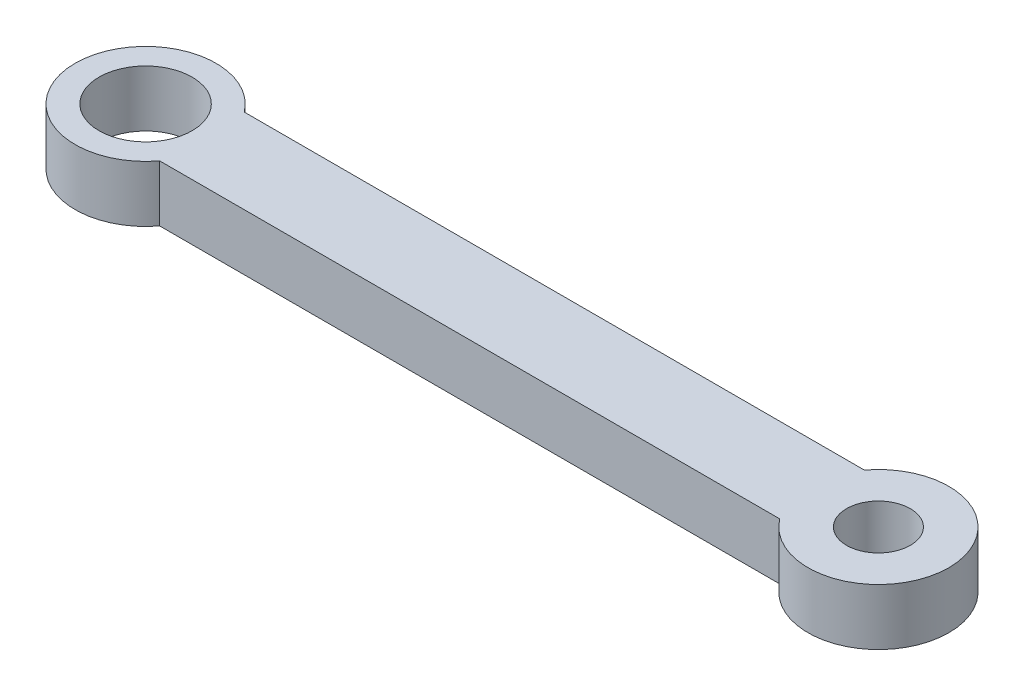
ISO-10303-21;
HEADER;
FILE_DESCRIPTION(('STEP AP214'),'2;1');
FILE_NAME('part.step','',(''),(''),'','','');
FILE_SCHEMA(('AUTOMOTIVE_DESIGN { 1 0 10303 214 1 1 1 1 }'));
ENDSEC;
DATA;
#1=APPLICATION_CONTEXT('core data for automotive mechanical design processes');
#2=APPLICATION_PROTOCOL_DEFINITION('international standard','automotive_design',2000,#1);
#3=PRODUCT_CONTEXT('',#1,'mechanical');
#4=PRODUCT('Part','Part','',(#3));
#5=PRODUCT_RELATED_PRODUCT_CATEGORY('part','',(#4));
#6=PRODUCT_DEFINITION_FORMATION('','',#4);
#7=PRODUCT_DEFINITION_CONTEXT('part definition',#1,'design');
#8=PRODUCT_DEFINITION('design','',#6,#7);
#9=PRODUCT_DEFINITION_SHAPE('','',#8);
#10=(LENGTH_UNIT() NAMED_UNIT(*) SI_UNIT(.MILLI.,.METRE.));
#11=(NAMED_UNIT(*) PLANE_ANGLE_UNIT() SI_UNIT($,.RADIAN.));
#12=(NAMED_UNIT(*) SI_UNIT($,.STERADIAN.) SOLID_ANGLE_UNIT());
#13=UNCERTAINTY_MEASURE_WITH_UNIT(LENGTH_MEASURE(1.E-05),#10,'distance_accuracy_value','');
#14=(GEOMETRIC_REPRESENTATION_CONTEXT(3) GLOBAL_UNCERTAINTY_ASSIGNED_CONTEXT((#13)) GLOBAL_UNIT_ASSIGNED_CONTEXT((#10,
#11,#12)) REPRESENTATION_CONTEXT('',''));
#15=CARTESIAN_POINT('',(0.,0.,0.));
#16=DIRECTION('',(0.,0.,1.));
#17=DIRECTION('',(1.,0.,0.));
#18=AXIS2_PLACEMENT_3D('',#15,#16,#17);
#19=CARTESIAN_POINT('',(-13.,2.,0.));
#20=DIRECTION('',(0.,1.,0.));
#21=DIRECTION('',(0.,0.,1.));
#22=AXIS2_PLACEMENT_3D('',#19,#20,#21);
#23=PLANE('',#22);
#24=CARTESIAN_POINT('',(-13.,2.,0.));
#25=DIRECTION('',(0.,1.,0.));
#26=DIRECTION('',(0.,0.,1.));
#27=AXIS2_PLACEMENT_3D('',#24,#25,#26);
#28=CIRCLE('',#27,1.65);
#29=CARTESIAN_POINT('',(-13.,2.,1.65));
#30=VERTEX_POINT('',#29);
#31=EDGE_CURVE('E100',#30,#30,#28,.T.);
#32=ORIENTED_EDGE('',*,*,#31,.F.);
#33=EDGE_LOOP('',(#32));
#34=FACE_BOUND('',#33,.T.);
#35=CARTESIAN_POINT('',(-13.,2.,0.));
#36=DIRECTION('',(0.,1.,0.));
#37=DIRECTION('',(0.,0.,1.));
#38=AXIS2_PLACEMENT_3D('',#35,#36,#37);
#39=CIRCLE('',#38,2.5);
#40=CARTESIAN_POINT('',(-11.,2.,-1.5));
#41=VERTEX_POINT('',#40);
#42=CARTESIAN_POINT('',(-11.,2.,1.5));
#43=VERTEX_POINT('',#42);
#44=EDGE_CURVE('E85',#41,#43,#39,.T.);
#45=ORIENTED_EDGE('',*,*,#44,.T.);
#46=DIRECTION('',(1.,0.,0.));
#47=VECTOR('',#46,1.);
#48=CARTESIAN_POINT('',(-11.,2.,1.5));
#49=LINE('',#48,#47);
#50=CARTESIAN_POINT('',(11.,2.,1.5));
#51=VERTEX_POINT('',#50);
#52=EDGE_CURVE('E80',#43,#51,#49,.T.);
#53=ORIENTED_EDGE('',*,*,#52,.T.);
#54=CARTESIAN_POINT('',(13.,2.,0.));
#55=DIRECTION('',(0.,1.,0.));
#56=DIRECTION('',(0.,0.,-1.));
#57=AXIS2_PLACEMENT_3D('',#54,#55,#56);
#58=CIRCLE('',#57,2.5);
#59=CARTESIAN_POINT('',(11.,2.,-1.50000000000001));
#60=VERTEX_POINT('',#59);
#61=EDGE_CURVE('E83',#51,#60,#58,.T.);
#62=ORIENTED_EDGE('',*,*,#61,.T.);
#63=DIRECTION('',(-1.,0.,0.));
#64=VECTOR('',#63,1.);
#65=CARTESIAN_POINT('',(-11.,2.,-1.5));
#66=LINE('',#65,#64);
#67=EDGE_CURVE('E50',#60,#41,#66,.T.);
#68=ORIENTED_EDGE('',*,*,#67,.T.);
#69=EDGE_LOOP('',(#45,#53,#62,#68));
#70=FACE_BOUND('',#69,.T.);
#71=CARTESIAN_POINT('',(13.,2.,0.));
#72=DIRECTION('',(0.,1.,0.));
#73=DIRECTION('',(0.,0.,1.));
#74=AXIS2_PLACEMENT_3D('',#71,#72,#73);
#75=CIRCLE('',#74,1.1303);
#76=CARTESIAN_POINT('',(13.,2.,1.1303));
#77=VERTEX_POINT('',#76);
#78=EDGE_CURVE('E115',#77,#77,#75,.T.);
#79=ORIENTED_EDGE('',*,*,#78,.F.);
#80=EDGE_LOOP('',(#79));
#81=FACE_BOUND('',#80,.T.);
#82=ADVANCED_FACE('F33',(#34,#70,#81),#23,.T.);
#83=CARTESIAN_POINT('',(-13.,0.,0.));
#84=DIRECTION('',(0.,1.,0.));
#85=DIRECTION('',(0.,0.,1.));
#86=AXIS2_PLACEMENT_3D('',#83,#84,#85);
#87=PLANE('',#86);
#88=CARTESIAN_POINT('',(-13.,0.,0.));
#89=DIRECTION('',(0.,1.,0.));
#90=DIRECTION('',(0.,0.,1.));
#91=AXIS2_PLACEMENT_3D('',#88,#89,#90);
#92=CIRCLE('',#91,2.5);
#93=CARTESIAN_POINT('',(-11.,0.,-1.5));
#94=VERTEX_POINT('',#93);
#95=CARTESIAN_POINT('',(-11.,0.,1.5));
#96=VERTEX_POINT('',#95);
#97=EDGE_CURVE('E97',#94,#96,#92,.T.);
#98=ORIENTED_EDGE('',*,*,#97,.F.);
#99=DIRECTION('',(-1.,0.,0.));
#100=VECTOR('',#99,1.);
#101=CARTESIAN_POINT('',(-11.,0.,-1.5));
#102=LINE('',#101,#100);
#103=CARTESIAN_POINT('',(11.,0.,-1.50000000000001));
#104=VERTEX_POINT('',#103);
#105=EDGE_CURVE('E73',#104,#94,#102,.T.);
#106=ORIENTED_EDGE('',*,*,#105,.F.);
#107=CARTESIAN_POINT('',(13.,0.,0.));
#108=DIRECTION('',(0.,1.,0.));
#109=DIRECTION('',(0.,0.,-1.));
#110=AXIS2_PLACEMENT_3D('',#107,#108,#109);
#111=CIRCLE('',#110,2.5);
#112=CARTESIAN_POINT('',(11.,0.,1.5));
#113=VERTEX_POINT('',#112);
#114=EDGE_CURVE('E67',#113,#104,#111,.T.);
#115=ORIENTED_EDGE('',*,*,#114,.F.);
#116=DIRECTION('',(1.,0.,0.));
#117=VECTOR('',#116,1.);
#118=CARTESIAN_POINT('',(-11.,0.,1.5));
#119=LINE('',#118,#117);
#120=EDGE_CURVE('E89',#96,#113,#119,.T.);
#121=ORIENTED_EDGE('',*,*,#120,.F.);
#122=EDGE_LOOP('',(#98,#106,#115,#121));
#123=FACE_BOUND('',#122,.T.);
#124=CARTESIAN_POINT('',(-13.,0.,0.));
#125=DIRECTION('',(0.,1.,0.));
#126=DIRECTION('',(0.,0.,1.));
#127=AXIS2_PLACEMENT_3D('',#124,#125,#126);
#128=CIRCLE('',#127,1.65);
#129=CARTESIAN_POINT('',(-13.,0.,1.65));
#130=VERTEX_POINT('',#129);
#131=EDGE_CURVE('E112',#130,#130,#128,.T.);
#132=ORIENTED_EDGE('',*,*,#131,.T.);
#133=EDGE_LOOP('',(#132));
#134=FACE_BOUND('',#133,.T.);
#135=CARTESIAN_POINT('',(13.,0.,0.));
#136=DIRECTION('',(0.,1.,0.));
#137=DIRECTION('',(0.,0.,1.));
#138=AXIS2_PLACEMENT_3D('',#135,#136,#137);
#139=CIRCLE('',#138,1.1303);
#140=CARTESIAN_POINT('',(13.,0.,1.1303));
#141=VERTEX_POINT('',#140);
#142=EDGE_CURVE('E118',#141,#141,#139,.T.);
#143=ORIENTED_EDGE('',*,*,#142,.T.);
#144=EDGE_LOOP('',(#143));
#145=FACE_BOUND('',#144,.T.);
#146=ADVANCED_FACE('F108',(#123,#134,#145),#87,.F.);
#147=CARTESIAN_POINT('',(-13.,2.,0.));
#148=DIRECTION('',(0.,-1.,0.));
#149=DIRECTION('',(0.,0.,-1.));
#150=AXIS2_PLACEMENT_3D('',#147,#148,#149);
#151=CYLINDRICAL_SURFACE('',#150,2.5);
#152=ORIENTED_EDGE('',*,*,#97,.T.);
#153=DIRECTION('',(0.,-1.,0.));
#154=VECTOR('',#153,1.);
#155=CARTESIAN_POINT('',(-11.,2.,1.5));
#156=LINE('',#155,#154);
#157=EDGE_CURVE('E11',#43,#96,#156,.T.);
#158=ORIENTED_EDGE('',*,*,#157,.F.);
#159=ORIENTED_EDGE('',*,*,#44,.F.);
#160=DIRECTION('',(0.,-1.,0.));
#161=VECTOR('',#160,1.);
#162=CARTESIAN_POINT('',(-11.,2.,-1.5));
#163=LINE('',#162,#161);
#164=EDGE_CURVE('E93',#41,#94,#163,.T.);
#165=ORIENTED_EDGE('',*,*,#164,.T.);
#166=EDGE_LOOP('',(#152,#158,#159,#165));
#167=FACE_BOUND('',#166,.T.);
#168=ADVANCED_FACE('F35',(#167),#151,.T.);
#169=CARTESIAN_POINT('',(-11.,2.,1.5));
#170=DIRECTION('',(0.,0.,-1.));
#171=DIRECTION('',(-1.,0.,0.));
#172=AXIS2_PLACEMENT_3D('',#169,#170,#171);
#173=PLANE('',#172);
#174=ORIENTED_EDGE('',*,*,#120,.T.);
#175=DIRECTION('',(0.,-1.,0.));
#176=VECTOR('',#175,1.);
#177=CARTESIAN_POINT('',(11.,2.,1.5));
#178=LINE('',#177,#176);
#179=EDGE_CURVE('E42',#51,#113,#178,.T.);
#180=ORIENTED_EDGE('',*,*,#179,.F.);
#181=ORIENTED_EDGE('',*,*,#52,.F.);
#182=ORIENTED_EDGE('',*,*,#157,.T.);
#183=EDGE_LOOP('',(#174,#180,#181,#182));
#184=FACE_BOUND('',#183,.T.);
#185=ADVANCED_FACE('F88',(#184),#173,.F.);
#186=CARTESIAN_POINT('',(13.,2.,0.));
#187=DIRECTION('',(0.,-1.,0.));
#188=DIRECTION('',(0.,0.,-1.));
#189=AXIS2_PLACEMENT_3D('',#186,#187,#188);
#190=CYLINDRICAL_SURFACE('',#189,2.5);
#191=ORIENTED_EDGE('',*,*,#114,.T.);
#192=DIRECTION('',(0.,-1.,0.));
#193=VECTOR('',#192,1.);
#194=CARTESIAN_POINT('',(11.,2.,-1.50000000000001));
#195=LINE('',#194,#193);
#196=EDGE_CURVE('E90',#60,#104,#195,.T.);
#197=ORIENTED_EDGE('',*,*,#196,.F.);
#198=ORIENTED_EDGE('',*,*,#61,.F.);
#199=ORIENTED_EDGE('',*,*,#179,.T.);
#200=EDGE_LOOP('',(#191,#197,#198,#199));
#201=FACE_BOUND('',#200,.T.);
#202=ADVANCED_FACE('F91',(#201),#190,.T.);
#203=CARTESIAN_POINT('',(-11.,2.,-1.5));
#204=DIRECTION('',(0.,0.,1.));
#205=DIRECTION('',(1.,0.,0.));
#206=AXIS2_PLACEMENT_3D('',#203,#204,#205);
#207=PLANE('',#206);
#208=ORIENTED_EDGE('',*,*,#105,.T.);
#209=ORIENTED_EDGE('',*,*,#164,.F.);
#210=ORIENTED_EDGE('',*,*,#67,.F.);
#211=ORIENTED_EDGE('',*,*,#196,.T.);
#212=EDGE_LOOP('',(#208,#209,#210,#211));
#213=FACE_BOUND('',#212,.T.);
#214=ADVANCED_FACE('F105',(#213),#207,.F.);
#215=CARTESIAN_POINT('',(-13.,2.,0.));
#216=DIRECTION('',(0.,-1.,0.));
#217=DIRECTION('',(0.,0.,-1.));
#218=AXIS2_PLACEMENT_3D('',#215,#216,#217);
#219=CYLINDRICAL_SURFACE('',#218,1.65);
#220=ORIENTED_EDGE('',*,*,#31,.T.);
#221=EDGE_LOOP('',(#220));
#222=FACE_BOUND('',#221,.T.);
#223=ORIENTED_EDGE('',*,*,#131,.F.);
#224=EDGE_LOOP('',(#223));
#225=FACE_BOUND('',#224,.T.);
#226=ADVANCED_FACE('F135',(#222,#225),#219,.F.);
#227=CARTESIAN_POINT('',(13.,2.,0.));
#228=DIRECTION('',(0.,-1.,0.));
#229=DIRECTION('',(0.,0.,-1.));
#230=AXIS2_PLACEMENT_3D('',#227,#228,#229);
#231=CYLINDRICAL_SURFACE('',#230,1.1303);
#232=ORIENTED_EDGE('',*,*,#78,.T.);
#233=EDGE_LOOP('',(#232));
#234=FACE_BOUND('',#233,.T.);
#235=ORIENTED_EDGE('',*,*,#142,.F.);
#236=EDGE_LOOP('',(#235));
#237=FACE_BOUND('',#236,.T.);
#238=ADVANCED_FACE('F124',(#234,#237),#231,.F.);
#239=CLOSED_SHELL('',(#82,#146,#168,#185,#202,#214,#226,#238));
#240=MANIFOLD_SOLID_BREP('B2',#239);
#241=ADVANCED_BREP_SHAPE_REPRESENTATION('',(#18,#240),#14);
#242=SHAPE_DEFINITION_REPRESENTATION(#9,#241);
ENDSEC;
END-ISO-10303-21;
